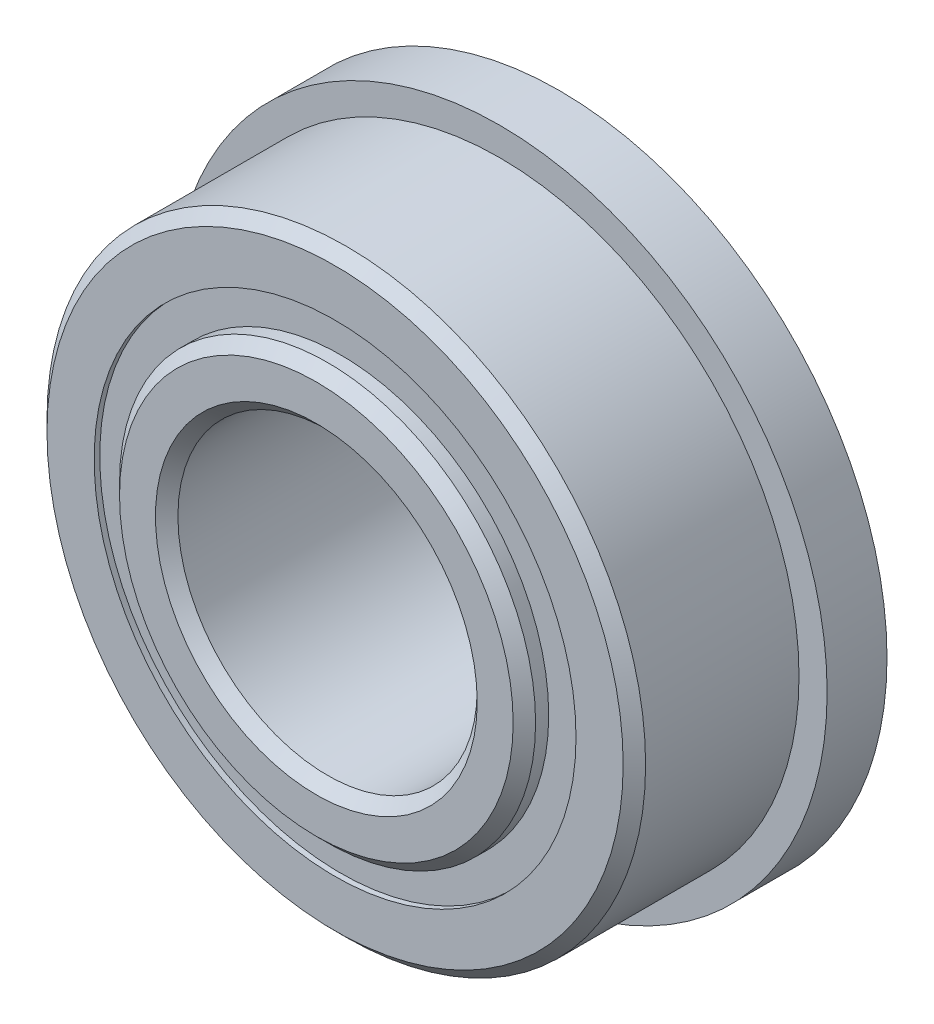
ISO-10303-21;
HEADER;
FILE_DESCRIPTION(('STEP AP214'),'2;1');
FILE_NAME('part.step','',(''),(''),'','','');
FILE_SCHEMA(('AUTOMOTIVE_DESIGN { 1 0 10303 214 1 1 1 1 }'));
ENDSEC;
DATA;
#1=APPLICATION_CONTEXT('core data for automotive mechanical design processes');
#2=APPLICATION_PROTOCOL_DEFINITION('international standard','automotive_design',2000,#1);
#3=PRODUCT_CONTEXT('',#1,'mechanical');
#4=PRODUCT('Part','Part','',(#3));
#5=PRODUCT_RELATED_PRODUCT_CATEGORY('part','',(#4));
#6=PRODUCT_DEFINITION_FORMATION('','',#4);
#7=PRODUCT_DEFINITION_CONTEXT('part definition',#1,'design');
#8=PRODUCT_DEFINITION('design','',#6,#7);
#9=PRODUCT_DEFINITION_SHAPE('','',#8);
#10=(LENGTH_UNIT() NAMED_UNIT(*) SI_UNIT(.MILLI.,.METRE.));
#11=(NAMED_UNIT(*) PLANE_ANGLE_UNIT() SI_UNIT($,.RADIAN.));
#12=(NAMED_UNIT(*) SI_UNIT($,.STERADIAN.) SOLID_ANGLE_UNIT());
#13=UNCERTAINTY_MEASURE_WITH_UNIT(LENGTH_MEASURE(1.E-05),#10,'distance_accuracy_value','');
#14=(GEOMETRIC_REPRESENTATION_CONTEXT(3) GLOBAL_UNCERTAINTY_ASSIGNED_CONTEXT((#13)) GLOBAL_UNIT_ASSIGNED_CONTEXT((#10,
#11,#12)) REPRESENTATION_CONTEXT('',''));
#15=CARTESIAN_POINT('',(0.,0.,0.));
#16=DIRECTION('',(0.,0.,1.));
#17=DIRECTION('',(1.,0.,0.));
#18=AXIS2_PLACEMENT_3D('',#15,#16,#17);
#19=CARTESIAN_POINT('',(0.,5.1114010989011,-2.2621875));
#20=DIRECTION('',(0.,0.,1.));
#21=DIRECTION('',(1.,0.,0.));
#22=AXIS2_PLACEMENT_3D('',#19,#20,#21);
#23=PLANE('',#22);
#24=CARTESIAN_POINT('',(0.,0.,-2.2621875));
#25=DIRECTION('',(0.,0.,1.));
#26=DIRECTION('',(1.,0.,0.));
#27=AXIS2_PLACEMENT_3D('',#24,#25,#26);
#28=CIRCLE('',#27,5.1114010989011);
#29=CARTESIAN_POINT('',(5.1114010989011,0.,-2.2621875));
#30=VERTEX_POINT('',#29);
#31=EDGE_CURVE('E57',#30,#30,#28,.T.);
#32=ORIENTED_EDGE('',*,*,#31,.F.);
#33=EDGE_LOOP('',(#32));
#34=FACE_BOUND('',#33,.T.);
#35=CARTESIAN_POINT('',(0.,0.,-2.2621875));
#36=DIRECTION('',(0.,0.,1.));
#37=DIRECTION('',(1.,0.,0.));
#38=AXIS2_PLACEMENT_3D('',#35,#36,#37);
#39=CIRCLE('',#38,4.4135989010989);
#40=CARTESIAN_POINT('',(4.4135989010989,0.,-2.2621875));
#41=VERTEX_POINT('',#40);
#42=EDGE_CURVE('E11',#41,#41,#39,.T.);
#43=ORIENTED_EDGE('',*,*,#42,.T.);
#44=EDGE_LOOP('',(#43));
#45=FACE_BOUND('',#44,.T.);
#46=ADVANCED_FACE('F43',(#34,#45),#23,.F.);
#47=CARTESIAN_POINT('',(0.,0.,2.38125));
#48=DIRECTION('',(0.,0.,1.));
#49=DIRECTION('',(1.,0.,0.));
#50=AXIS2_PLACEMENT_3D('',#47,#48,#49);
#51=CYLINDRICAL_SURFACE('',#50,4.4135989010989);
#52=ORIENTED_EDGE('',*,*,#42,.F.);
#53=EDGE_LOOP('',(#52));
#54=FACE_BOUND('',#53,.T.);
#55=CARTESIAN_POINT('',(0.,0.,-1.11436144103197));
#56=DIRECTION('',(0.,0.,1.));
#57=DIRECTION('',(1.,0.,0.));
#58=AXIS2_PLACEMENT_3D('',#55,#56,#57);
#59=CIRCLE('',#58,4.4135989010989);
#60=CARTESIAN_POINT('',(4.4135989010989,0.,-1.11436144103197));
#61=VERTEX_POINT('',#60);
#62=EDGE_CURVE('E49',#61,#61,#59,.T.);
#63=ORIENTED_EDGE('',*,*,#62,.T.);
#64=EDGE_LOOP('',(#63));
#65=FACE_BOUND('',#64,.T.);
#66=ADVANCED_FACE('F66',(#54,#65),#51,.F.);
#67=CARTESIAN_POINT('',(0.,5.1114010989011,-1.11436144103197));
#68=DIRECTION('',(0.,0.,-1.));
#69=DIRECTION('',(-1.,0.,0.));
#70=AXIS2_PLACEMENT_3D('',#67,#68,#69);
#71=PLANE('',#70);
#72=ORIENTED_EDGE('',*,*,#62,.F.);
#73=EDGE_LOOP('',(#72));
#74=FACE_BOUND('',#73,.T.);
#75=CARTESIAN_POINT('',(0.,0.,-1.11436144103197));
#76=DIRECTION('',(0.,0.,1.));
#77=DIRECTION('',(1.,0.,0.));
#78=AXIS2_PLACEMENT_3D('',#75,#76,#77);
#79=CIRCLE('',#78,5.1114010989011);
#80=CARTESIAN_POINT('',(5.1114010989011,0.,-1.11436144103197));
#81=VERTEX_POINT('',#80);
#82=EDGE_CURVE('E53',#81,#81,#79,.T.);
#83=ORIENTED_EDGE('',*,*,#82,.T.);
#84=EDGE_LOOP('',(#83));
#85=FACE_BOUND('',#84,.T.);
#86=ADVANCED_FACE('F70',(#74,#85),#71,.F.);
#87=CARTESIAN_POINT('',(0.,0.,2.38125));
#88=DIRECTION('',(0.,0.,1.));
#89=DIRECTION('',(1.,0.,0.));
#90=AXIS2_PLACEMENT_3D('',#87,#88,#89);
#91=CYLINDRICAL_SURFACE('',#90,5.1114010989011);
#92=ORIENTED_EDGE('',*,*,#82,.F.);
#93=EDGE_LOOP('',(#92));
#94=FACE_BOUND('',#93,.T.);
#95=ORIENTED_EDGE('',*,*,#31,.T.);
#96=EDGE_LOOP('',(#95));
#97=FACE_BOUND('',#96,.T.);
#98=ADVANCED_FACE('F63',(#94,#97),#91,.T.);
#99=CLOSED_SHELL('',(#46,#66,#86,#98));
#100=MANIFOLD_SOLID_BREP('B2',#99);
#101=CARTESIAN_POINT('',(0.,5.1114010989011,2.2621875));
#102=DIRECTION('',(0.,0.,-1.));
#103=DIRECTION('',(-1.,0.,0.));
#104=AXIS2_PLACEMENT_3D('',#101,#102,#103);
#105=PLANE('',#104);
#106=CARTESIAN_POINT('',(0.,0.,2.2621875));
#107=DIRECTION('',(0.,0.,1.));
#108=DIRECTION('',(1.,0.,0.));
#109=AXIS2_PLACEMENT_3D('',#106,#107,#108);
#110=CIRCLE('',#109,4.4135989010989);
#111=CARTESIAN_POINT('',(4.4135989010989,0.,2.2621875));
#112=VERTEX_POINT('',#111);
#113=EDGE_CURVE('E42',#112,#112,#110,.T.);
#114=ORIENTED_EDGE('',*,*,#113,.F.);
#115=EDGE_LOOP('',(#114));
#116=FACE_BOUND('',#115,.T.);
#117=CARTESIAN_POINT('',(0.,0.,2.2621875));
#118=DIRECTION('',(0.,0.,1.));
#119=DIRECTION('',(1.,0.,0.));
#120=AXIS2_PLACEMENT_3D('',#117,#118,#119);
#121=CIRCLE('',#120,5.1114010989011);
#122=CARTESIAN_POINT('',(5.1114010989011,0.,2.2621875));
#123=VERTEX_POINT('',#122);
#124=EDGE_CURVE('E124',#123,#123,#121,.T.);
#125=ORIENTED_EDGE('',*,*,#124,.T.);
#126=EDGE_LOOP('',(#125));
#127=FACE_BOUND('',#126,.T.);
#128=ADVANCED_FACE('F110',(#116,#127),#105,.F.);
#129=CARTESIAN_POINT('',(0.,0.,2.38125));
#130=DIRECTION('',(0.,0.,1.));
#131=DIRECTION('',(1.,0.,0.));
#132=AXIS2_PLACEMENT_3D('',#129,#130,#131);
#133=CYLINDRICAL_SURFACE('',#132,4.4135989010989);
#134=CARTESIAN_POINT('',(0.,0.,1.11436144103196));
#135=DIRECTION('',(0.,0.,1.));
#136=DIRECTION('',(1.,0.,0.));
#137=AXIS2_PLACEMENT_3D('',#134,#135,#136);
#138=CIRCLE('',#137,4.4135989010989);
#139=CARTESIAN_POINT('',(4.4135989010989,0.,1.11436144103196));
#140=VERTEX_POINT('',#139);
#141=EDGE_CURVE('E116',#140,#140,#138,.T.);
#142=ORIENTED_EDGE('',*,*,#141,.F.);
#143=EDGE_LOOP('',(#142));
#144=FACE_BOUND('',#143,.T.);
#145=ORIENTED_EDGE('',*,*,#113,.T.);
#146=EDGE_LOOP('',(#145));
#147=FACE_BOUND('',#146,.T.);
#148=ADVANCED_FACE('F139',(#144,#147),#133,.F.);
#149=CARTESIAN_POINT('',(0.,5.1114010989011,1.11436144103197));
#150=DIRECTION('',(0.,0.,1.));
#151=DIRECTION('',(1.,0.,0.));
#152=AXIS2_PLACEMENT_3D('',#149,#150,#151);
#153=PLANE('',#152);
#154=CARTESIAN_POINT('',(0.,0.,1.11436144103197));
#155=DIRECTION('',(0.,0.,1.));
#156=DIRECTION('',(1.,0.,0.));
#157=AXIS2_PLACEMENT_3D('',#154,#155,#156);
#158=CIRCLE('',#157,5.1114010989011);
#159=CARTESIAN_POINT('',(5.1114010989011,0.,1.11436144103197));
#160=VERTEX_POINT('',#159);
#161=EDGE_CURVE('E120',#160,#160,#158,.T.);
#162=ORIENTED_EDGE('',*,*,#161,.F.);
#163=EDGE_LOOP('',(#162));
#164=FACE_BOUND('',#163,.T.);
#165=ORIENTED_EDGE('',*,*,#141,.T.);
#166=EDGE_LOOP('',(#165));
#167=FACE_BOUND('',#166,.T.);
#168=ADVANCED_FACE('F134',(#164,#167),#153,.F.);
#169=CARTESIAN_POINT('',(0.,0.,2.38125));
#170=DIRECTION('',(0.,0.,1.));
#171=DIRECTION('',(1.,0.,0.));
#172=AXIS2_PLACEMENT_3D('',#169,#170,#171);
#173=CYLINDRICAL_SURFACE('',#172,5.1114010989011);
#174=ORIENTED_EDGE('',*,*,#124,.F.);
#175=EDGE_LOOP('',(#174));
#176=FACE_BOUND('',#175,.T.);
#177=ORIENTED_EDGE('',*,*,#161,.T.);
#178=EDGE_LOOP('',(#177));
#179=FACE_BOUND('',#178,.T.);
#180=ADVANCED_FACE('F131',(#176,#179),#173,.T.);
#181=CLOSED_SHELL('',(#128,#148,#168,#180));
#182=MANIFOLD_SOLID_BREP('B6',#181);
#183=CARTESIAN_POINT('',(-2.38124999999995,4.12444598552342,0.));
#184=DIRECTION('',(0.,0.,1.));
#185=DIRECTION('',(-0.499999999999989,0.866025403784445,0.));
#186=AXIS2_PLACEMENT_3D('',#183,#184,#185);
#187=SPHERICAL_SURFACE('',#186,1.11436144103197);
#188=CARTESIAN_POINT('',(-2.38124999999995,4.12444598552342,1.11436144103197));
#189=VERTEX_POINT('',#188);
#190=VERTEX_LOOP('',#189);
#191=FACE_BOUND('',#190,.T.);
#192=ADVANCED_FACE('F177',(#191),#187,.T.);
#193=CLOSED_SHELL('',(#192));
#194=MANIFOLD_SOLID_BREP('B37',#193);
#195=CARTESIAN_POINT('',(-4.12444598552336,2.38125000000005,0.));
#196=DIRECTION('',(0.,0.,1.));
#197=DIRECTION('',(-0.866025403784433,0.50000000000001,0.));
#198=AXIS2_PLACEMENT_3D('',#195,#196,#197);
#199=SPHERICAL_SURFACE('',#198,1.11436144103197);
#200=CARTESIAN_POINT('',(-4.12444598552336,2.38125000000005,1.11436144103197));
#201=VERTEX_POINT('',#200);
#202=VERTEX_LOOP('',#201);
#203=FACE_BOUND('',#202,.T.);
#204=ADVANCED_FACE('F197',(#203),#199,.T.);
#205=CLOSED_SHELL('',(#204));
#206=MANIFOLD_SOLID_BREP('B106',#205);
#207=CARTESIAN_POINT('',(-4.7625,0.,0.));
#208=DIRECTION('',(0.,0.,1.));
#209=DIRECTION('',(-1.,0.,0.));
#210=AXIS2_PLACEMENT_3D('',#207,#208,#209);
#211=SPHERICAL_SURFACE('',#210,1.11436144103197);
#212=CARTESIAN_POINT('',(-4.7625,0.,1.11436144103197));
#213=VERTEX_POINT('',#212);
#214=VERTEX_LOOP('',#213);
#215=FACE_BOUND('',#214,.T.);
#216=ADVANCED_FACE('F217',(#215),#211,.T.);
#217=CLOSED_SHELL('',(#216));
#218=MANIFOLD_SOLID_BREP('B173',#217);
#219=CARTESIAN_POINT('',(-4.12444598552341,-2.38124999999996,0.));
#220=DIRECTION('',(0.,0.,1.));
#221=DIRECTION('',(-0.866025403784443,-0.499999999999992,0.));
#222=AXIS2_PLACEMENT_3D('',#219,#220,#221);
#223=SPHERICAL_SURFACE('',#222,1.11436144103197);
#224=CARTESIAN_POINT('',(-4.12444598552341,-2.38124999999996,1.11436144103197));
#225=VERTEX_POINT('',#224);
#226=VERTEX_LOOP('',#225);
#227=FACE_BOUND('',#226,.T.);
#228=ADVANCED_FACE('F237',(#227),#223,.T.);
#229=CLOSED_SHELL('',(#228));
#230=MANIFOLD_SOLID_BREP('B193',#229);
#231=CARTESIAN_POINT('',(-2.38125000000003,-4.12444598552337,0.));
#232=DIRECTION('',(0.,0.,1.));
#233=DIRECTION('',(-0.500000000000007,-0.866025403784435,0.));
#234=AXIS2_PLACEMENT_3D('',#231,#232,#233);
#235=SPHERICAL_SURFACE('',#234,1.11436144103197);
#236=CARTESIAN_POINT('',(-2.38125000000003,-4.12444598552337,1.11436144103197));
#237=VERTEX_POINT('',#236);
#238=VERTEX_LOOP('',#237);
#239=FACE_BOUND('',#238,.T.);
#240=ADVANCED_FACE('F257',(#239),#235,.T.);
#241=CLOSED_SHELL('',(#240));
#242=MANIFOLD_SOLID_BREP('B213',#241);
#243=CARTESIAN_POINT('',(0.,-4.7625,0.));
#244=DIRECTION('',(0.,0.,1.));
#245=DIRECTION('',(0.,-1.,0.));
#246=AXIS2_PLACEMENT_3D('',#243,#244,#245);
#247=SPHERICAL_SURFACE('',#246,1.11436144103197);
#248=CARTESIAN_POINT('',(0.,-4.7625,1.11436144103197));
#249=VERTEX_POINT('',#248);
#250=VERTEX_LOOP('',#249);
#251=FACE_BOUND('',#250,.T.);
#252=ADVANCED_FACE('F277',(#251),#247,.T.);
#253=CLOSED_SHELL('',(#252));
#254=MANIFOLD_SOLID_BREP('B233',#253);
#255=CARTESIAN_POINT('',(2.38124999999998,-4.1244459855234,0.));
#256=DIRECTION('',(0.,0.,1.));
#257=DIRECTION('',(0.499999999999995,-0.866025403784442,0.));
#258=AXIS2_PLACEMENT_3D('',#255,#256,#257);
#259=SPHERICAL_SURFACE('',#258,1.11436144103197);
#260=CARTESIAN_POINT('',(2.38124999999998,-4.1244459855234,1.11436144103197));
#261=VERTEX_POINT('',#260);
#262=VERTEX_LOOP('',#261);
#263=FACE_BOUND('',#262,.T.);
#264=ADVANCED_FACE('F297',(#263),#259,.T.);
#265=CLOSED_SHELL('',(#264));
#266=MANIFOLD_SOLID_BREP('B253',#265);
#267=CARTESIAN_POINT('',(4.12444598552338,-2.38125000000002,0.));
#268=DIRECTION('',(0.,0.,1.));
#269=DIRECTION('',(0.866025403784436,-0.500000000000004,0.));
#270=AXIS2_PLACEMENT_3D('',#267,#268,#269);
#271=SPHERICAL_SURFACE('',#270,1.11436144103197);
#272=CARTESIAN_POINT('',(4.12444598552338,-2.38125000000002,1.11436144103197));
#273=VERTEX_POINT('',#272);
#274=VERTEX_LOOP('',#273);
#275=FACE_BOUND('',#274,.T.);
#276=ADVANCED_FACE('F317',(#275),#271,.T.);
#277=CLOSED_SHELL('',(#276));
#278=MANIFOLD_SOLID_BREP('B273',#277);
#279=CARTESIAN_POINT('',(4.7625,0.,0.));
#280=DIRECTION('',(0.,0.,1.));
#281=DIRECTION('',(1.,0.,0.));
#282=AXIS2_PLACEMENT_3D('',#279,#280,#281);
#283=SPHERICAL_SURFACE('',#282,1.11436144103197);
#284=CARTESIAN_POINT('',(4.7625,0.,1.11436144103197));
#285=VERTEX_POINT('',#284);
#286=VERTEX_LOOP('',#285);
#287=FACE_BOUND('',#286,.T.);
#288=ADVANCED_FACE('F337',(#287),#283,.T.);
#289=CLOSED_SHELL('',(#288));
#290=MANIFOLD_SOLID_BREP('B293',#289);
#291=CARTESIAN_POINT('',(4.12444598552339,2.38124999999999,0.));
#292=DIRECTION('',(0.,0.,1.));
#293=DIRECTION('',(0.86602540378444,0.499999999999998,0.));
#294=AXIS2_PLACEMENT_3D('',#291,#292,#293);
#295=SPHERICAL_SURFACE('',#294,1.11436144103197);
#296=CARTESIAN_POINT('',(4.12444598552339,2.38124999999999,1.11436144103197));
#297=VERTEX_POINT('',#296);
#298=VERTEX_LOOP('',#297);
#299=FACE_BOUND('',#298,.T.);
#300=ADVANCED_FACE('F357',(#299),#295,.T.);
#301=CLOSED_SHELL('',(#300));
#302=MANIFOLD_SOLID_BREP('B313',#301);
#303=CARTESIAN_POINT('',(2.38125,4.12444598552339,0.));
#304=DIRECTION('',(0.,0.,1.));
#305=DIRECTION('',(0.500000000000001,0.866025403784438,0.));
#306=AXIS2_PLACEMENT_3D('',#303,#304,#305);
#307=SPHERICAL_SURFACE('',#306,1.11436144103197);
#308=CARTESIAN_POINT('',(2.38125,4.12444598552339,1.11436144103197));
#309=VERTEX_POINT('',#308);
#310=VERTEX_LOOP('',#309);
#311=FACE_BOUND('',#310,.T.);
#312=ADVANCED_FACE('F377',(#311),#307,.T.);
#313=CLOSED_SHELL('',(#312));
#314=MANIFOLD_SOLID_BREP('B333',#313);
#315=CARTESIAN_POINT('',(0.,4.7625,0.));
#316=DIRECTION('',(0.,0.,1.));
#317=DIRECTION('',(0.,1.,0.));
#318=AXIS2_PLACEMENT_3D('',#315,#316,#317);
#319=SPHERICAL_SURFACE('',#318,1.11436144103197);
#320=CARTESIAN_POINT('',(0.,4.7625,1.11436144103197));
#321=VERTEX_POINT('',#320);
#322=VERTEX_LOOP('',#321);
#323=FACE_BOUND('',#322,.T.);
#324=ADVANCED_FACE('F399',(#323),#319,.T.);
#325=CLOSED_SHELL('',(#324));
#326=MANIFOLD_SOLID_BREP('B353',#325);
#327=CARTESIAN_POINT('',(0.,0.,2.540635));
#328=DIRECTION('',(0.,0.,-1.));
#329=DIRECTION('',(-1.,0.,0.));
#330=AXIS2_PLACEMENT_3D('',#327,#328,#329);
#331=CONICAL_SURFACE('',#330,4.4135989010989,0.785398163397446);
#332=CARTESIAN_POINT('',(0.,0.,2.77876));
#333=DIRECTION('',(0.,0.,1.));
#334=DIRECTION('',(1.,0.,0.));
#335=AXIS2_PLACEMENT_3D('',#332,#333,#334);
#336=CIRCLE('',#335,4.1754739010989);
#337=CARTESIAN_POINT('',(4.1754739010989,0.,2.77876));
#338=VERTEX_POINT('',#337);
#339=EDGE_CURVE('E452',#338,#338,#336,.T.);
#340=ORIENTED_EDGE('',*,*,#339,.F.);
#341=EDGE_LOOP('',(#340));
#342=FACE_BOUND('',#341,.T.);
#343=CARTESIAN_POINT('',(0.,0.,2.540635));
#344=DIRECTION('',(0.,0.,1.));
#345=DIRECTION('',(1.,0.,0.));
#346=AXIS2_PLACEMENT_3D('',#343,#344,#345);
#347=CIRCLE('',#346,4.4135989010989);
#348=CARTESIAN_POINT('',(4.4135989010989,0.,2.540635));
#349=VERTEX_POINT('',#348);
#350=EDGE_CURVE('E398',#349,#349,#347,.T.);
#351=ORIENTED_EDGE('',*,*,#350,.T.);
#352=EDGE_LOOP('',(#351));
#353=FACE_BOUND('',#352,.T.);
#354=ADVANCED_FACE('F418',(#342,#353),#331,.T.);
#355=CARTESIAN_POINT('',(0.,0.,2.38125));
#356=DIRECTION('',(0.,0.,1.));
#357=DIRECTION('',(1.,0.,0.));
#358=AXIS2_PLACEMENT_3D('',#355,#356,#357);
#359=CYLINDRICAL_SURFACE('',#358,4.4135989010989);
#360=ORIENTED_EDGE('',*,*,#350,.F.);
#361=EDGE_LOOP('',(#360));
#362=FACE_BOUND('',#361,.T.);
#363=CARTESIAN_POINT('',(0.,0.,1.05833333333333));
#364=DIRECTION('',(0.,0.,1.));
#365=DIRECTION('',(1.,0.,0.));
#366=AXIS2_PLACEMENT_3D('',#363,#364,#365);
#367=CIRCLE('',#366,4.4135989010989);
#368=CARTESIAN_POINT('',(4.4135989010989,0.,1.05833333333333));
#369=VERTEX_POINT('',#368);
#370=EDGE_CURVE('E424',#369,#369,#367,.T.);
#371=ORIENTED_EDGE('',*,*,#370,.T.);
#372=EDGE_LOOP('',(#371));
#373=FACE_BOUND('',#372,.T.);
#374=ADVANCED_FACE('F459',(#362,#373),#359,.T.);
#375=CARTESIAN_POINT('',(0.,0.,0.));
#376=DIRECTION('',(0.,0.,1.));
#377=DIRECTION('',(1.,0.,0.));
#378=AXIS2_PLACEMENT_3D('',#375,#376,#377);
#379=TOROIDAL_SURFACE('',#378,4.76249999999999,1.11436144103196);
#380=ORIENTED_EDGE('',*,*,#370,.F.);
#381=EDGE_LOOP('',(#380));
#382=FACE_BOUND('',#381,.T.);
#383=CARTESIAN_POINT('',(0.,0.,-1.05833333333333));
#384=DIRECTION('',(0.,0.,1.));
#385=DIRECTION('',(1.,0.,0.));
#386=AXIS2_PLACEMENT_3D('',#383,#384,#385);
#387=CIRCLE('',#386,4.4135989010989);
#388=CARTESIAN_POINT('',(4.4135989010989,0.,-1.05833333333333));
#389=VERTEX_POINT('',#388);
#390=EDGE_CURVE('E428',#389,#389,#387,.T.);
#391=ORIENTED_EDGE('',*,*,#390,.T.);
#392=EDGE_LOOP('',(#391));
#393=FACE_BOUND('',#392,.T.);
#394=ADVANCED_FACE('F463',(#382,#393),#379,.F.);
#395=CARTESIAN_POINT('',(0.,0.,2.38125));
#396=DIRECTION('',(0.,0.,1.));
#397=DIRECTION('',(1.,0.,0.));
#398=AXIS2_PLACEMENT_3D('',#395,#396,#397);
#399=CYLINDRICAL_SURFACE('',#398,4.4135989010989);
#400=ORIENTED_EDGE('',*,*,#390,.F.);
#401=EDGE_LOOP('',(#400));
#402=FACE_BOUND('',#401,.T.);
#403=CARTESIAN_POINT('',(0.,0.,-2.540635));
#404=DIRECTION('',(0.,0.,1.));
#405=DIRECTION('',(1.,0.,0.));
#406=AXIS2_PLACEMENT_3D('',#403,#404,#405);
#407=CIRCLE('',#406,4.4135989010989);
#408=CARTESIAN_POINT('',(4.4135989010989,0.,-2.540635));
#409=VERTEX_POINT('',#408);
#410=EDGE_CURVE('E432',#409,#409,#407,.T.);
#411=ORIENTED_EDGE('',*,*,#410,.T.);
#412=EDGE_LOOP('',(#411));
#413=FACE_BOUND('',#412,.T.);
#414=ADVANCED_FACE('F468',(#402,#413),#399,.T.);
#415=CARTESIAN_POINT('',(0.,0.,-2.77876));
#416=DIRECTION('',(0.,0.,1.));
#417=DIRECTION('',(1.,0.,0.));
#418=AXIS2_PLACEMENT_3D('',#415,#416,#417);
#419=CONICAL_SURFACE('',#418,4.1754739010989,0.785398163397447);
#420=ORIENTED_EDGE('',*,*,#410,.F.);
#421=EDGE_LOOP('',(#420));
#422=FACE_BOUND('',#421,.T.);
#423=CARTESIAN_POINT('',(0.,0.,-2.77876));
#424=DIRECTION('',(0.,0.,1.));
#425=DIRECTION('',(1.,0.,0.));
#426=AXIS2_PLACEMENT_3D('',#423,#424,#425);
#427=CIRCLE('',#426,4.1754739010989);
#428=CARTESIAN_POINT('',(4.1754739010989,0.,-2.77876));
#429=VERTEX_POINT('',#428);
#430=EDGE_CURVE('E437',#429,#429,#427,.T.);
#431=ORIENTED_EDGE('',*,*,#430,.T.);
#432=EDGE_LOOP('',(#431));
#433=FACE_BOUND('',#432,.T.);
#434=ADVANCED_FACE('F474',(#422,#433),#419,.T.);
#435=CARTESIAN_POINT('',(0.,4.1754739010989,-2.77876));
#436=DIRECTION('',(0.,0.,1.));
#437=DIRECTION('',(1.,0.,0.));
#438=AXIS2_PLACEMENT_3D('',#435,#436,#437);
#439=PLANE('',#438);
#440=ORIENTED_EDGE('',*,*,#430,.F.);
#441=EDGE_LOOP('',(#440));
#442=FACE_BOUND('',#441,.T.);
#443=CARTESIAN_POINT('',(0.,0.,-2.77876));
#444=DIRECTION('',(0.,0.,1.));
#445=DIRECTION('',(1.,0.,0.));
#446=AXIS2_PLACEMENT_3D('',#443,#444,#445);
#447=CIRCLE('',#446,3.413125);
#448=CARTESIAN_POINT('',(3.413125,0.,-2.77876));
#449=VERTEX_POINT('',#448);
#450=EDGE_CURVE('E440',#449,#449,#447,.T.);
#451=ORIENTED_EDGE('',*,*,#450,.T.);
#452=EDGE_LOOP('',(#451));
#453=FACE_BOUND('',#452,.T.);
#454=ADVANCED_FACE('F478',(#442,#453),#439,.F.);
#455=CARTESIAN_POINT('',(0.,0.,-2.540635));
#456=DIRECTION('',(0.,0.,-1.));
#457=DIRECTION('',(-1.,0.,0.));
#458=AXIS2_PLACEMENT_3D('',#455,#456,#457);
#459=CONICAL_SURFACE('',#458,3.175,0.785398163397447);
#460=ORIENTED_EDGE('',*,*,#450,.F.);
#461=EDGE_LOOP('',(#460));
#462=FACE_BOUND('',#461,.T.);
#463=CARTESIAN_POINT('',(0.,0.,-2.540635));
#464=DIRECTION('',(0.,0.,1.));
#465=DIRECTION('',(1.,0.,0.));
#466=AXIS2_PLACEMENT_3D('',#463,#464,#465);
#467=CIRCLE('',#466,3.175);
#468=CARTESIAN_POINT('',(3.175,0.,-2.540635));
#469=VERTEX_POINT('',#468);
#470=EDGE_CURVE('E443',#469,#469,#467,.T.);
#471=ORIENTED_EDGE('',*,*,#470,.T.);
#472=EDGE_LOOP('',(#471));
#473=FACE_BOUND('',#472,.T.);
#474=ADVANCED_FACE('F482',(#462,#473),#459,.F.);
#475=CARTESIAN_POINT('',(0.,0.,2.38125));
#476=DIRECTION('',(0.,0.,1.));
#477=DIRECTION('',(1.,0.,0.));
#478=AXIS2_PLACEMENT_3D('',#475,#476,#477);
#479=CYLINDRICAL_SURFACE('',#478,3.175);
#480=ORIENTED_EDGE('',*,*,#470,.F.);
#481=EDGE_LOOP('',(#480));
#482=FACE_BOUND('',#481,.T.);
#483=CARTESIAN_POINT('',(0.,0.,2.540635));
#484=DIRECTION('',(0.,0.,1.));
#485=DIRECTION('',(1.,0.,0.));
#486=AXIS2_PLACEMENT_3D('',#483,#484,#485);
#487=CIRCLE('',#486,3.175);
#488=CARTESIAN_POINT('',(3.175,0.,2.540635));
#489=VERTEX_POINT('',#488);
#490=EDGE_CURVE('E446',#489,#489,#487,.T.);
#491=ORIENTED_EDGE('',*,*,#490,.T.);
#492=EDGE_LOOP('',(#491));
#493=FACE_BOUND('',#492,.T.);
#494=ADVANCED_FACE('F486',(#482,#493),#479,.F.);
#495=CARTESIAN_POINT('',(0.,0.,2.77876));
#496=DIRECTION('',(0.,0.,1.));
#497=DIRECTION('',(1.,0.,0.));
#498=AXIS2_PLACEMENT_3D('',#495,#496,#497);
#499=CONICAL_SURFACE('',#498,3.413125,0.78539816339745);
#500=ORIENTED_EDGE('',*,*,#490,.F.);
#501=EDGE_LOOP('',(#500));
#502=FACE_BOUND('',#501,.T.);
#503=CARTESIAN_POINT('',(0.,0.,2.77876));
#504=DIRECTION('',(0.,0.,1.));
#505=DIRECTION('',(1.,0.,0.));
#506=AXIS2_PLACEMENT_3D('',#503,#504,#505);
#507=CIRCLE('',#506,3.413125);
#508=CARTESIAN_POINT('',(3.413125,0.,2.77876));
#509=VERTEX_POINT('',#508);
#510=EDGE_CURVE('E449',#509,#509,#507,.T.);
#511=ORIENTED_EDGE('',*,*,#510,.T.);
#512=EDGE_LOOP('',(#511));
#513=FACE_BOUND('',#512,.T.);
#514=ADVANCED_FACE('F490',(#502,#513),#499,.F.);
#515=CARTESIAN_POINT('',(0.,3.413125,2.77876));
#516=DIRECTION('',(0.,0.,-1.));
#517=DIRECTION('',(-1.,0.,0.));
#518=AXIS2_PLACEMENT_3D('',#515,#516,#517);
#519=PLANE('',#518);
#520=ORIENTED_EDGE('',*,*,#510,.F.);
#521=EDGE_LOOP('',(#520));
#522=FACE_BOUND('',#521,.T.);
#523=ORIENTED_EDGE('',*,*,#339,.T.);
#524=EDGE_LOOP('',(#523));
#525=FACE_BOUND('',#524,.T.);
#526=ADVANCED_FACE('F456',(#522,#525),#519,.F.);
#527=CLOSED_SHELL('',(#354,#374,#394,#414,#434,#454,#474,#494,#514,#526));
#528=MANIFOLD_SOLID_BREP('B373',#527);
#529=CARTESIAN_POINT('',(0.,0.,2.143125));
#530=DIRECTION('',(0.,0.,-1.));
#531=DIRECTION('',(-1.,0.,0.));
#532=AXIS2_PLACEMENT_3D('',#529,#530,#531);
#533=CONICAL_SURFACE('',#532,6.35,0.785398163397447);
#534=CARTESIAN_POINT('',(0.,0.,2.38125));
#535=DIRECTION('',(0.,0.,1.));
#536=DIRECTION('',(1.,0.,0.));
#537=AXIS2_PLACEMENT_3D('',#534,#535,#536);
#538=CIRCLE('',#537,6.111875);
#539=CARTESIAN_POINT('',(6.111875,0.,2.38125));
#540=VERTEX_POINT('',#539);
#541=EDGE_CURVE('E591',#540,#540,#538,.T.);
#542=ORIENTED_EDGE('',*,*,#541,.F.);
#543=EDGE_LOOP('',(#542));
#544=FACE_BOUND('',#543,.T.);
#545=CARTESIAN_POINT('',(0.,0.,2.143125));
#546=DIRECTION('',(0.,0.,1.));
#547=DIRECTION('',(1.,0.,0.));
#548=AXIS2_PLACEMENT_3D('',#545,#546,#547);
#549=CIRCLE('',#548,6.35);
#550=CARTESIAN_POINT('',(6.35,0.,2.143125));
#551=VERTEX_POINT('',#550);
#552=EDGE_CURVE('E417',#551,#551,#549,.T.);
#553=ORIENTED_EDGE('',*,*,#552,.T.);
#554=EDGE_LOOP('',(#553));
#555=FACE_BOUND('',#554,.T.);
#556=ADVANCED_FACE('F569',(#544,#555),#533,.T.);
#557=CARTESIAN_POINT('',(0.,0.,2.38125));
#558=DIRECTION('',(0.,0.,1.));
#559=DIRECTION('',(1.,0.,0.));
#560=AXIS2_PLACEMENT_3D('',#557,#558,#559);
#561=CYLINDRICAL_SURFACE('',#560,6.35);
#562=CARTESIAN_POINT('',(0.,0.,-1.11125));
#563=DIRECTION('',(0.,0.,1.));
#564=DIRECTION('',(1.,0.,0.));
#565=AXIS2_PLACEMENT_3D('',#562,#563,#564);
#566=CIRCLE('',#565,6.35);
#567=CARTESIAN_POINT('',(6.35,0.,-1.11125));
#568=VERTEX_POINT('',#567);
#569=EDGE_CURVE('E594',#568,#568,#566,.T.);
#570=ORIENTED_EDGE('',*,*,#569,.T.);
#571=EDGE_LOOP('',(#570));
#572=FACE_BOUND('',#571,.T.);
#573=ORIENTED_EDGE('',*,*,#552,.F.);
#574=EDGE_LOOP('',(#573));
#575=FACE_BOUND('',#574,.T.);
#576=ADVANCED_FACE('F614',(#572,#575),#561,.T.);
#577=CARTESIAN_POINT('',(0.,6.111875,-2.38125));
#578=DIRECTION('',(0.,0.,1.));
#579=DIRECTION('',(1.,0.,0.));
#580=AXIS2_PLACEMENT_3D('',#577,#578,#579);
#581=PLANE('',#580);
#582=CARTESIAN_POINT('',(0.,0.,-2.38125));
#583=DIRECTION('',(0.,0.,1.));
#584=DIRECTION('',(1.,0.,0.));
#585=AXIS2_PLACEMENT_3D('',#582,#583,#584);
#586=CIRCLE('',#585,5.1114010989011);
#587=CARTESIAN_POINT('',(5.1114010989011,0.,-2.38125));
#588=VERTEX_POINT('',#587);
#589=EDGE_CURVE('E575',#588,#588,#586,.T.);
#590=ORIENTED_EDGE('',*,*,#589,.T.);
#591=EDGE_LOOP('',(#590));
#592=FACE_BOUND('',#591,.T.);
#593=CARTESIAN_POINT('',(0.,0.,-2.38125));
#594=DIRECTION('',(0.,0.,-1.));
#595=DIRECTION('',(-1.,0.,0.));
#596=AXIS2_PLACEMENT_3D('',#593,#594,#595);
#597=CIRCLE('',#596,6.9469);
#598=CARTESIAN_POINT('',(-6.9469,0.,-2.38125));
#599=VERTEX_POINT('',#598);
#600=EDGE_CURVE('E597',#599,#599,#597,.T.);
#601=ORIENTED_EDGE('',*,*,#600,.T.);
#602=EDGE_LOOP('',(#601));
#603=FACE_BOUND('',#602,.T.);
#604=ADVANCED_FACE('F617',(#592,#603),#581,.F.);
#605=CARTESIAN_POINT('',(0.,0.,2.38125));
#606=DIRECTION('',(0.,0.,1.));
#607=DIRECTION('',(1.,0.,0.));
#608=AXIS2_PLACEMENT_3D('',#605,#606,#607);
#609=CYLINDRICAL_SURFACE('',#608,5.1114010989011);
#610=CARTESIAN_POINT('',(0.,0.,-1.05833333333333));
#611=DIRECTION('',(0.,0.,1.));
#612=DIRECTION('',(1.,0.,0.));
#613=AXIS2_PLACEMENT_3D('',#610,#611,#612);
#614=CIRCLE('',#613,5.1114010989011);
#615=CARTESIAN_POINT('',(5.1114010989011,0.,-1.05833333333333));
#616=VERTEX_POINT('',#615);
#617=EDGE_CURVE('E579',#616,#616,#614,.T.);
#618=ORIENTED_EDGE('',*,*,#617,.T.);
#619=EDGE_LOOP('',(#618));
#620=FACE_BOUND('',#619,.T.);
#621=ORIENTED_EDGE('',*,*,#589,.F.);
#622=EDGE_LOOP('',(#621));
#623=FACE_BOUND('',#622,.T.);
#624=ADVANCED_FACE('F622',(#620,#623),#609,.F.);
#625=CARTESIAN_POINT('',(0.,0.,0.));
#626=DIRECTION('',(0.,0.,1.));
#627=DIRECTION('',(1.,0.,0.));
#628=AXIS2_PLACEMENT_3D('',#625,#626,#627);
#629=TOROIDAL_SURFACE('',#628,4.7625,1.11436144103197);
#630=ORIENTED_EDGE('',*,*,#617,.F.);
#631=EDGE_LOOP('',(#630));
#632=FACE_BOUND('',#631,.T.);
#633=CARTESIAN_POINT('',(0.,0.,1.05833333333333));
#634=DIRECTION('',(0.,0.,1.));
#635=DIRECTION('',(1.,0.,0.));
#636=AXIS2_PLACEMENT_3D('',#633,#634,#635);
#637=CIRCLE('',#636,5.1114010989011);
#638=CARTESIAN_POINT('',(5.1114010989011,0.,1.05833333333333));
#639=VERTEX_POINT('',#638);
#640=EDGE_CURVE('E583',#639,#639,#637,.T.);
#641=ORIENTED_EDGE('',*,*,#640,.T.);
#642=EDGE_LOOP('',(#641));
#643=FACE_BOUND('',#642,.T.);
#644=ADVANCED_FACE('F628',(#632,#643),#629,.F.);
#645=CARTESIAN_POINT('',(0.,0.,2.38125));
#646=DIRECTION('',(0.,0.,1.));
#647=DIRECTION('',(1.,0.,0.));
#648=AXIS2_PLACEMENT_3D('',#645,#646,#647);
#649=CYLINDRICAL_SURFACE('',#648,5.1114010989011);
#650=ORIENTED_EDGE('',*,*,#640,.F.);
#651=EDGE_LOOP('',(#650));
#652=FACE_BOUND('',#651,.T.);
#653=CARTESIAN_POINT('',(0.,0.,2.38125));
#654=DIRECTION('',(0.,0.,1.));
#655=DIRECTION('',(1.,0.,0.));
#656=AXIS2_PLACEMENT_3D('',#653,#654,#655);
#657=CIRCLE('',#656,5.1114010989011);
#658=CARTESIAN_POINT('',(5.1114010989011,0.,2.38125));
#659=VERTEX_POINT('',#658);
#660=EDGE_CURVE('E588',#659,#659,#657,.T.);
#661=ORIENTED_EDGE('',*,*,#660,.T.);
#662=EDGE_LOOP('',(#661));
#663=FACE_BOUND('',#662,.T.);
#664=ADVANCED_FACE('F632',(#652,#663),#649,.F.);
#665=CARTESIAN_POINT('',(0.,6.111875,2.38125));
#666=DIRECTION('',(0.,0.,-1.));
#667=DIRECTION('',(-1.,0.,0.));
#668=AXIS2_PLACEMENT_3D('',#665,#666,#667);
#669=PLANE('',#668);
#670=ORIENTED_EDGE('',*,*,#660,.F.);
#671=EDGE_LOOP('',(#670));
#672=FACE_BOUND('',#671,.T.);
#673=ORIENTED_EDGE('',*,*,#541,.T.);
#674=EDGE_LOOP('',(#673));
#675=FACE_BOUND('',#674,.T.);
#676=ADVANCED_FACE('F610',(#672,#675),#669,.F.);
#677=CARTESIAN_POINT('',(0.,5.1114010989011,-1.11125));
#678=DIRECTION('',(0.,0.,1.));
#679=DIRECTION('',(1.,0.,0.));
#680=AXIS2_PLACEMENT_3D('',#677,#678,#679);
#681=PLANE('',#680);
#682=CARTESIAN_POINT('',(0.,0.,-1.11125));
#683=DIRECTION('',(0.,0.,-1.));
#684=DIRECTION('',(-1.,0.,0.));
#685=AXIS2_PLACEMENT_3D('',#682,#683,#684);
#686=CIRCLE('',#685,6.9469);
#687=CARTESIAN_POINT('',(-6.9469,0.,-1.11125));
#688=VERTEX_POINT('',#687);
#689=EDGE_CURVE('E600',#688,#688,#686,.T.);
#690=ORIENTED_EDGE('',*,*,#689,.F.);
#691=EDGE_LOOP('',(#690));
#692=FACE_BOUND('',#691,.T.);
#693=ORIENTED_EDGE('',*,*,#569,.F.);
#694=EDGE_LOOP('',(#693));
#695=FACE_BOUND('',#694,.T.);
#696=ADVANCED_FACE('F607',(#692,#695),#681,.T.);
#697=CARTESIAN_POINT('',(0.,0.,-2.38125));
#698=DIRECTION('',(0.,0.,-1.));
#699=DIRECTION('',(-1.,0.,0.));
#700=AXIS2_PLACEMENT_3D('',#697,#698,#699);
#701=CYLINDRICAL_SURFACE('',#700,6.9469);
#702=ORIENTED_EDGE('',*,*,#689,.T.);
#703=EDGE_LOOP('',(#702));
#704=FACE_BOUND('',#703,.T.);
#705=ORIENTED_EDGE('',*,*,#600,.F.);
#706=EDGE_LOOP('',(#705));
#707=FACE_BOUND('',#706,.T.);
#708=ADVANCED_FACE('F604',(#704,#707),#701,.T.);
#709=CLOSED_SHELL('',(#556,#576,#604,#624,#644,#664,#676,#696,#708));
#710=MANIFOLD_SOLID_BREP('B393',#709);
#711=ADVANCED_BREP_SHAPE_REPRESENTATION('',(#18,#100,#182,#194,#206,#218,#230,#242,#254,#266,
#278,#290,#302,#314,#326,#528,#710),#14);
#712=SHAPE_DEFINITION_REPRESENTATION(#9,#711);
ENDSEC;
END-ISO-10303-21;
